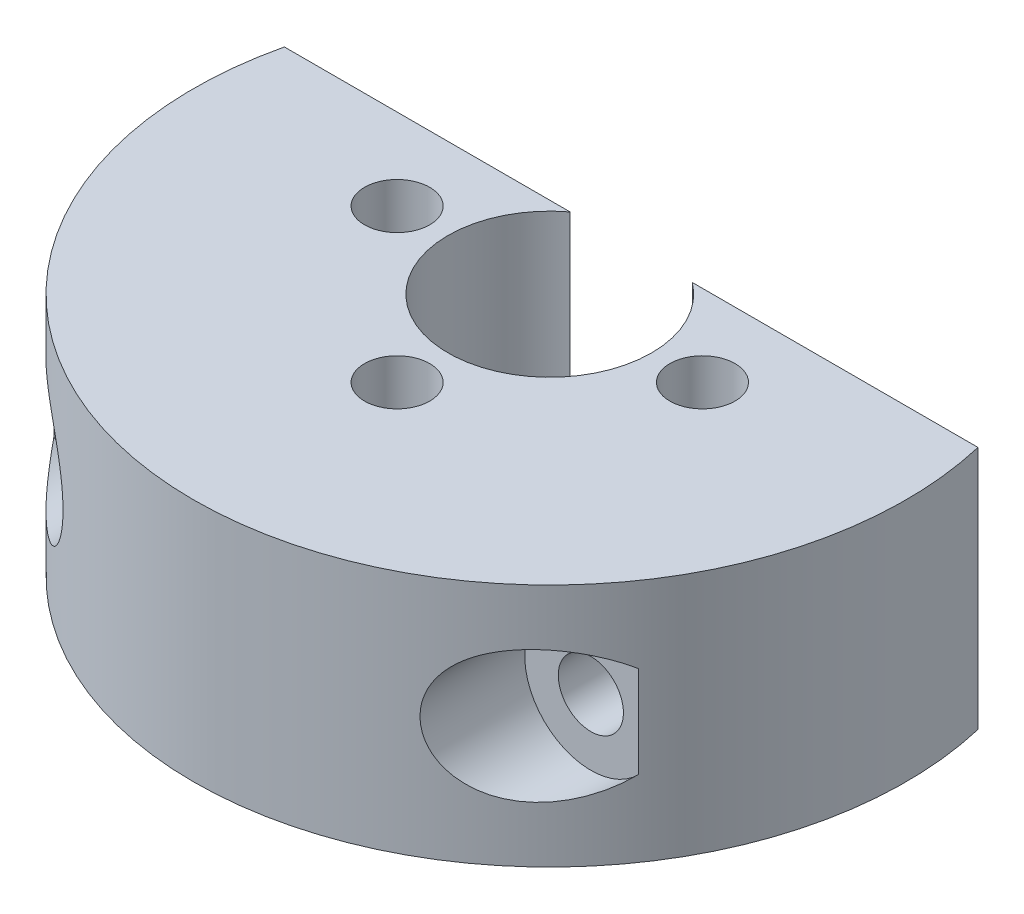
ISO-10303-21;
HEADER;
FILE_DESCRIPTION(('STEP AP214'),'2;1');
FILE_NAME('part.step','',(''),(''),'','','');
FILE_SCHEMA(('AUTOMOTIVE_DESIGN { 1 0 10303 214 1 1 1 1 }'));
ENDSEC;
DATA;
#1=APPLICATION_CONTEXT('core data for automotive mechanical design processes');
#2=APPLICATION_PROTOCOL_DEFINITION('international standard','automotive_design',2000,#1);
#3=PRODUCT_CONTEXT('',#1,'mechanical');
#4=PRODUCT('Part','Part','',(#3));
#5=PRODUCT_RELATED_PRODUCT_CATEGORY('part','',(#4));
#6=PRODUCT_DEFINITION_FORMATION('','',#4);
#7=PRODUCT_DEFINITION_CONTEXT('part definition',#1,'design');
#8=PRODUCT_DEFINITION('design','',#6,#7);
#9=PRODUCT_DEFINITION_SHAPE('','',#8);
#10=(LENGTH_UNIT() NAMED_UNIT(*) SI_UNIT(.MILLI.,.METRE.));
#11=(NAMED_UNIT(*) PLANE_ANGLE_UNIT() SI_UNIT($,.RADIAN.));
#12=(NAMED_UNIT(*) SI_UNIT($,.STERADIAN.) SOLID_ANGLE_UNIT());
#13=UNCERTAINTY_MEASURE_WITH_UNIT(LENGTH_MEASURE(1.E-05),#10,'distance_accuracy_value','');
#14=(GEOMETRIC_REPRESENTATION_CONTEXT(3) GLOBAL_UNCERTAINTY_ASSIGNED_CONTEXT((#13)) GLOBAL_UNIT_ASSIGNED_CONTEXT((#10,
#11,#12)) REPRESENTATION_CONTEXT('',''));
#15=CARTESIAN_POINT('',(0.,0.,0.));
#16=DIRECTION('',(0.,0.,1.));
#17=DIRECTION('',(1.,0.,0.));
#18=AXIS2_PLACEMENT_3D('',#15,#16,#17);
#19=CARTESIAN_POINT('',(-12.0183625187004,6.,17.501));
#20=DIRECTION('',(0.,0.,-1.));
#21=DIRECTION('',(-1.,0.,0.));
#22=AXIS2_PLACEMENT_3D('',#19,#20,#21);
#23=CYLINDRICAL_SURFACE('',#22,1.6);
#24=CARTESIAN_POINT('',(-12.0183625187004,6.,-4.));
#25=DIRECTION('',(0.,0.,-1.));
#26=DIRECTION('',(-1.,0.,0.));
#27=AXIS2_PLACEMENT_3D('',#24,#25,#26);
#28=CIRCLE('',#27,1.6);
#29=CARTESIAN_POINT('',(-13.6183625187004,6.,-4.));
#30=VERTEX_POINT('',#29);
#31=EDGE_CURVE('E207',#30,#30,#28,.T.);
#32=CARTESIAN_POINT('',(-12.0183625187004,6.,10.));
#33=DIRECTION('',(0.,0.,1.));
#34=DIRECTION('',(1.,0.,0.));
#35=AXIS2_PLACEMENT_3D('',#32,#33,#34);
#36=CIRCLE('',#35,1.6);
#37=CARTESIAN_POINT('',(-13.6183625187004,6.,10.));
#38=VERTEX_POINT('',#37);
#39=EDGE_CURVE('E108',#38,#38,#36,.F.);
#40=CARTESIAN_POINT('',(-13.6183625187004,6.,-4.));
#41=CARTESIAN_POINT('',(-13.6183625187004,6.,-3.85416666666666));
#42=CARTESIAN_POINT('',(-13.6183625187004,6.,-3.70833333333333));
#43=CARTESIAN_POINT('',(-13.6183625187004,6.,-3.41666666666666));
#44=CARTESIAN_POINT('',(-13.6183625187004,6.,-3.27083333333333));
#45=CARTESIAN_POINT('',(-13.6183625187004,6.,-2.97916666666666));
#46=CARTESIAN_POINT('',(-13.6183625187004,6.,-2.83333333333333));
#47=CARTESIAN_POINT('',(-13.6183625187004,6.,-2.54166666666666));
#48=CARTESIAN_POINT('',(-13.6183625187004,6.,-2.39583333333333));
#49=CARTESIAN_POINT('',(-13.6183625187004,6.,-2.10416666666666));
#50=CARTESIAN_POINT('',(-13.6183625187004,6.,-1.95833333333333));
#51=CARTESIAN_POINT('',(-13.6183625187004,6.,-1.66666666666666));
#52=CARTESIAN_POINT('',(-13.6183625187004,6.,-1.52083333333333));
#53=CARTESIAN_POINT('',(-13.6183625187004,6.,-1.22916666666666));
#54=CARTESIAN_POINT('',(-13.6183625187004,6.,-1.08333333333333));
#55=CARTESIAN_POINT('',(-13.6183625187004,6.,-0.791666666666662));
#56=CARTESIAN_POINT('',(-13.6183625187004,6.,-0.645833333333329));
#57=CARTESIAN_POINT('',(-13.6183625187004,6.,-0.354166666666664));
#58=CARTESIAN_POINT('',(-13.6183625187004,6.,-0.20833333333333));
#59=CARTESIAN_POINT('',(-13.6183625187004,6.,0.0833333333333368));
#60=CARTESIAN_POINT('',(-13.6183625187004,6.,0.22916666666667));
#61=CARTESIAN_POINT('',(-13.6183625187004,6.,0.520833333333337));
#62=CARTESIAN_POINT('',(-13.6183625187004,6.,0.666666666666671));
#63=CARTESIAN_POINT('',(-13.6183625187004,6.,0.958333333333338));
#64=CARTESIAN_POINT('',(-13.6183625187004,6.,1.10416666666667));
#65=CARTESIAN_POINT('',(-13.6183625187004,6.,1.39583333333334));
#66=CARTESIAN_POINT('',(-13.6183625187004,6.,1.54166666666667));
#67=CARTESIAN_POINT('',(-13.6183625187004,6.,1.83333333333334));
#68=CARTESIAN_POINT('',(-13.6183625187004,6.,1.97916666666667));
#69=CARTESIAN_POINT('',(-13.6183625187004,6.,2.27083333333334));
#70=CARTESIAN_POINT('',(-13.6183625187004,6.,2.41666666666667));
#71=CARTESIAN_POINT('',(-13.6183625187004,6.,2.70833333333334));
#72=CARTESIAN_POINT('',(-13.6183625187004,6.,2.85416666666667));
#73=CARTESIAN_POINT('',(-13.6183625187004,6.,3.14583333333334));
#74=CARTESIAN_POINT('',(-13.6183625187004,6.,3.29166666666667));
#75=CARTESIAN_POINT('',(-13.6183625187004,6.,3.58333333333334));
#76=CARTESIAN_POINT('',(-13.6183625187004,6.,3.72916666666667));
#77=CARTESIAN_POINT('',(-13.6183625187004,6.,4.02083333333334));
#78=CARTESIAN_POINT('',(-13.6183625187004,6.,4.16666666666667));
#79=CARTESIAN_POINT('',(-13.6183625187004,6.,4.45833333333334));
#80=CARTESIAN_POINT('',(-13.6183625187004,6.,4.60416666666667));
#81=CARTESIAN_POINT('',(-13.6183625187004,6.,4.89583333333334));
#82=CARTESIAN_POINT('',(-13.6183625187004,6.,5.04166666666667));
#83=CARTESIAN_POINT('',(-13.6183625187004,6.,5.33333333333334));
#84=CARTESIAN_POINT('',(-13.6183625187004,6.,5.47916666666667));
#85=CARTESIAN_POINT('',(-13.6183625187004,6.,5.77083333333334));
#86=CARTESIAN_POINT('',(-13.6183625187004,6.,5.91666666666667));
#87=CARTESIAN_POINT('',(-13.6183625187004,6.,6.20833333333334));
#88=CARTESIAN_POINT('',(-13.6183625187004,6.,6.35416666666667));
#89=CARTESIAN_POINT('',(-13.6183625187004,6.,6.64583333333334));
#90=CARTESIAN_POINT('',(-13.6183625187004,6.,6.79166666666667));
#91=CARTESIAN_POINT('',(-13.6183625187004,6.,7.08333333333334));
#92=CARTESIAN_POINT('',(-13.6183625187004,6.,7.22916666666667));
#93=CARTESIAN_POINT('',(-13.6183625187004,6.,7.52083333333334));
#94=CARTESIAN_POINT('',(-13.6183625187004,6.,7.66666666666667));
#95=CARTESIAN_POINT('',(-13.6183625187004,6.,7.95833333333334));
#96=CARTESIAN_POINT('',(-13.6183625187004,6.,8.10416666666667));
#97=CARTESIAN_POINT('',(-13.6183625187004,6.,8.39583333333334));
#98=CARTESIAN_POINT('',(-13.6183625187004,6.,8.54166666666667));
#99=CARTESIAN_POINT('',(-13.6183625187004,6.,8.83333333333334));
#100=CARTESIAN_POINT('',(-13.6183625187004,6.,8.97916666666667));
#101=CARTESIAN_POINT('',(-13.6183625187004,6.,9.27083333333334));
#102=CARTESIAN_POINT('',(-13.6183625187004,6.,9.41666666666667));
#103=CARTESIAN_POINT('',(-13.6183625187004,6.,9.70833333333334));
#104=CARTESIAN_POINT('',(-13.6183625187004,6.,9.85416666666667));
#105=CARTESIAN_POINT('',(-13.6183625187004,6.,10.));
#106=B_SPLINE_CURVE_WITH_KNOTS('',3,(#40,#41,#42,#43,#44,#45,#46,#47,#48,#49,#50,#51,#52,#53,
#54,#55,#56,#57,#58,#59,#60,#61,#62,#63,#64,#65,#66,#67,#68,#69,#70,#71,#72,#73,#74,#75,#76,#77,
#78,#79,#80,#81,#82,#83,#84,#85,#86,#87,#88,#89,#90,#91,#92,#93,#94,#95,#96,#97,#98,#99,#100,
#101,#102,#103,#104,#105),.UNSPECIFIED.,.F.,.F.,(4,2,2,2,2,2,2,2,2,2,2,2,2,2,2,2,2,2,2,2,2,2,2,
2,2,2,2,2,2,2,2,2,4),(0.,0.4375,0.875000000000001,1.3125,1.75,2.1875,2.625,3.0625,3.5,3.9375,
4.375,4.8125,5.25,5.6875,6.125,6.5625,7.,7.4375,7.875,8.3125,8.75,9.1875,9.625,10.0625,10.5,
10.9375,11.375,11.8125,12.25,12.6875,13.125,13.5625,14.),.UNSPECIFIED.);
#107=EDGE_CURVE('BSEAM45',#30,#38,#106,.T.);
#108=ORIENTED_EDGE('',*,*,#31,.T.);
#109=ORIENTED_EDGE('',*,*,#39,.F.);
#110=ORIENTED_EDGE('',*,*,#107,.T.);
#111=ORIENTED_EDGE('',*,*,#107,.F.);
#112=EDGE_LOOP('',(#108,#110,#109,#111));
#113=FACE_BOUND('',#112,.T.);
#114=ADVANCED_FACE('F45',(#113),#23,.F.);
#115=CARTESIAN_POINT('',(12.0183625187004,6.,17.501));
#116=DIRECTION('',(0.,0.,-1.));
#117=DIRECTION('',(-1.,0.,0.));
#118=AXIS2_PLACEMENT_3D('',#115,#116,#117);
#119=CYLINDRICAL_SURFACE('',#118,1.6);
#120=CARTESIAN_POINT('',(12.0183625187004,6.,-4.));
#121=DIRECTION('',(0.,0.,-1.));
#122=DIRECTION('',(-1.,0.,0.));
#123=AXIS2_PLACEMENT_3D('',#120,#121,#122);
#124=CIRCLE('',#123,1.6);
#125=CARTESIAN_POINT('',(10.4183625187004,6.,-4.));
#126=VERTEX_POINT('',#125);
#127=EDGE_CURVE('E208',#126,#126,#124,.T.);
#128=CARTESIAN_POINT('',(12.0183625187004,6.,10.));
#129=DIRECTION('',(0.,0.,1.));
#130=DIRECTION('',(1.,0.,0.));
#131=AXIS2_PLACEMENT_3D('',#128,#129,#130);
#132=CIRCLE('',#131,1.6);
#133=CARTESIAN_POINT('',(10.4183625187004,6.,10.));
#134=VERTEX_POINT('',#133);
#135=EDGE_CURVE('E109',#134,#134,#132,.F.);
#136=CARTESIAN_POINT('',(10.4183625187004,6.,-4.));
#137=CARTESIAN_POINT('',(10.4183625187004,6.,-3.85416666666666));
#138=CARTESIAN_POINT('',(10.4183625187004,6.,-3.70833333333333));
#139=CARTESIAN_POINT('',(10.4183625187004,6.,-3.41666666666666));
#140=CARTESIAN_POINT('',(10.4183625187004,6.,-3.27083333333333));
#141=CARTESIAN_POINT('',(10.4183625187004,6.,-2.97916666666666));
#142=CARTESIAN_POINT('',(10.4183625187004,6.,-2.83333333333333));
#143=CARTESIAN_POINT('',(10.4183625187004,6.,-2.54166666666666));
#144=CARTESIAN_POINT('',(10.4183625187004,6.,-2.39583333333333));
#145=CARTESIAN_POINT('',(10.4183625187004,6.,-2.10416666666666));
#146=CARTESIAN_POINT('',(10.4183625187004,6.,-1.95833333333333));
#147=CARTESIAN_POINT('',(10.4183625187004,6.,-1.66666666666666));
#148=CARTESIAN_POINT('',(10.4183625187004,6.,-1.52083333333333));
#149=CARTESIAN_POINT('',(10.4183625187004,6.,-1.22916666666666));
#150=CARTESIAN_POINT('',(10.4183625187004,6.,-1.08333333333333));
#151=CARTESIAN_POINT('',(10.4183625187004,6.,-0.791666666666662));
#152=CARTESIAN_POINT('',(10.4183625187004,6.,-0.645833333333329));
#153=CARTESIAN_POINT('',(10.4183625187004,6.,-0.354166666666664));
#154=CARTESIAN_POINT('',(10.4183625187004,6.,-0.20833333333333));
#155=CARTESIAN_POINT('',(10.4183625187004,6.,0.0833333333333368));
#156=CARTESIAN_POINT('',(10.4183625187004,6.,0.22916666666667));
#157=CARTESIAN_POINT('',(10.4183625187004,6.,0.520833333333337));
#158=CARTESIAN_POINT('',(10.4183625187004,6.,0.666666666666671));
#159=CARTESIAN_POINT('',(10.4183625187004,6.,0.958333333333338));
#160=CARTESIAN_POINT('',(10.4183625187004,6.,1.10416666666667));
#161=CARTESIAN_POINT('',(10.4183625187004,6.,1.39583333333334));
#162=CARTESIAN_POINT('',(10.4183625187004,6.,1.54166666666667));
#163=CARTESIAN_POINT('',(10.4183625187004,6.,1.83333333333334));
#164=CARTESIAN_POINT('',(10.4183625187004,6.,1.97916666666667));
#165=CARTESIAN_POINT('',(10.4183625187004,6.,2.27083333333334));
#166=CARTESIAN_POINT('',(10.4183625187004,6.,2.41666666666667));
#167=CARTESIAN_POINT('',(10.4183625187004,6.,2.70833333333334));
#168=CARTESIAN_POINT('',(10.4183625187004,6.,2.85416666666667));
#169=CARTESIAN_POINT('',(10.4183625187004,6.,3.14583333333334));
#170=CARTESIAN_POINT('',(10.4183625187004,6.,3.29166666666667));
#171=CARTESIAN_POINT('',(10.4183625187004,6.,3.58333333333334));
#172=CARTESIAN_POINT('',(10.4183625187004,6.,3.72916666666667));
#173=CARTESIAN_POINT('',(10.4183625187004,6.,4.02083333333334));
#174=CARTESIAN_POINT('',(10.4183625187004,6.,4.16666666666667));
#175=CARTESIAN_POINT('',(10.4183625187004,6.,4.45833333333334));
#176=CARTESIAN_POINT('',(10.4183625187004,6.,4.60416666666667));
#177=CARTESIAN_POINT('',(10.4183625187004,6.,4.89583333333334));
#178=CARTESIAN_POINT('',(10.4183625187004,6.,5.04166666666667));
#179=CARTESIAN_POINT('',(10.4183625187004,6.,5.33333333333334));
#180=CARTESIAN_POINT('',(10.4183625187004,6.,5.47916666666667));
#181=CARTESIAN_POINT('',(10.4183625187004,6.,5.77083333333334));
#182=CARTESIAN_POINT('',(10.4183625187004,6.,5.91666666666667));
#183=CARTESIAN_POINT('',(10.4183625187004,6.,6.20833333333334));
#184=CARTESIAN_POINT('',(10.4183625187004,6.,6.35416666666667));
#185=CARTESIAN_POINT('',(10.4183625187004,6.,6.64583333333334));
#186=CARTESIAN_POINT('',(10.4183625187004,6.,6.79166666666667));
#187=CARTESIAN_POINT('',(10.4183625187004,6.,7.08333333333334));
#188=CARTESIAN_POINT('',(10.4183625187004,6.,7.22916666666667));
#189=CARTESIAN_POINT('',(10.4183625187004,6.,7.52083333333334));
#190=CARTESIAN_POINT('',(10.4183625187004,6.,7.66666666666667));
#191=CARTESIAN_POINT('',(10.4183625187004,6.,7.95833333333334));
#192=CARTESIAN_POINT('',(10.4183625187004,6.,8.10416666666667));
#193=CARTESIAN_POINT('',(10.4183625187004,6.,8.39583333333334));
#194=CARTESIAN_POINT('',(10.4183625187004,6.,8.54166666666667));
#195=CARTESIAN_POINT('',(10.4183625187004,6.,8.83333333333334));
#196=CARTESIAN_POINT('',(10.4183625187004,6.,8.97916666666667));
#197=CARTESIAN_POINT('',(10.4183625187004,6.,9.27083333333334));
#198=CARTESIAN_POINT('',(10.4183625187004,6.,9.41666666666667));
#199=CARTESIAN_POINT('',(10.4183625187004,6.,9.70833333333334));
#200=CARTESIAN_POINT('',(10.4183625187004,6.,9.85416666666667));
#201=CARTESIAN_POINT('',(10.4183625187004,6.,10.));
#202=B_SPLINE_CURVE_WITH_KNOTS('',3,(#136,#137,#138,#139,#140,#141,#142,#143,#144,#145,#146,
#147,#148,#149,#150,#151,#152,#153,#154,#155,#156,#157,#158,#159,#160,#161,#162,#163,#164,#165,
#166,#167,#168,#169,#170,#171,#172,#173,#174,#175,#176,#177,#178,#179,#180,#181,#182,#183,#184,
#185,#186,#187,#188,#189,#190,#191,#192,#193,#194,#195,#196,#197,#198,#199,#200,#201),
.UNSPECIFIED.,.F.,.F.,(4,2,2,2,2,2,2,2,2,2,2,2,2,2,2,2,2,2,2,2,2,2,2,2,2,2,2,2,2,2,2,2,4),(0.,
0.4375,0.875000000000001,1.3125,1.75,2.1875,2.625,3.0625,3.5,3.9375,4.375,4.8125,5.25,5.6875,
6.125,6.5625,7.,7.4375,7.875,8.3125,8.75,9.1875,9.625,10.0625,10.5,10.9375,11.375,11.8125,12.25,
12.6875,13.125,13.5625,14.),.UNSPECIFIED.);
#203=EDGE_CURVE('BSEAM140',#126,#134,#202,.T.);
#204=ORIENTED_EDGE('',*,*,#127,.T.);
#205=ORIENTED_EDGE('',*,*,#135,.F.);
#206=ORIENTED_EDGE('',*,*,#203,.T.);
#207=ORIENTED_EDGE('',*,*,#203,.F.);
#208=EDGE_LOOP('',(#204,#206,#205,#207));
#209=FACE_BOUND('',#208,.T.);
#210=ADVANCED_FACE('F140',(#209),#119,.F.);
#211=CARTESIAN_POINT('',(0.,12.,0.));
#212=DIRECTION('',(0.,1.,0.));
#213=DIRECTION('',(0.,0.,1.));
#214=AXIS2_PLACEMENT_3D('',#211,#212,#213);
#215=PLANE('',#214);
#216=CARTESIAN_POINT('',(-7.5,12.,0.));
#217=DIRECTION('',(0.,1.,0.));
#218=DIRECTION('',(0.,0.,1.));
#219=AXIS2_PLACEMENT_3D('',#216,#217,#218);
#220=CIRCLE('',#219,1.6);
#221=CARTESIAN_POINT('',(-7.5,12.,1.6));
#222=VERTEX_POINT('',#221);
#223=EDGE_CURVE('E354',#222,#222,#220,.T.);
#224=ORIENTED_EDGE('',*,*,#223,.F.);
#225=EDGE_LOOP('',(#224));
#226=FACE_BOUND('',#225,.T.);
#227=CARTESIAN_POINT('',(7.5,12.,0.));
#228=DIRECTION('',(0.,1.,0.));
#229=DIRECTION('',(0.,0.,1.));
#230=AXIS2_PLACEMENT_3D('',#227,#228,#229);
#231=CIRCLE('',#230,1.6);
#232=CARTESIAN_POINT('',(7.5,12.,1.6));
#233=VERTEX_POINT('',#232);
#234=EDGE_CURVE('E356',#233,#233,#231,.T.);
#235=ORIENTED_EDGE('',*,*,#234,.F.);
#236=EDGE_LOOP('',(#235));
#237=FACE_BOUND('',#236,.T.);
#238=CARTESIAN_POINT('',(0.,12.,7.5));
#239=DIRECTION('',(0.,1.,0.));
#240=DIRECTION('',(0.,0.,1.));
#241=AXIS2_PLACEMENT_3D('',#238,#239,#240);
#242=CIRCLE('',#241,1.6);
#243=CARTESIAN_POINT('',(0.,12.,9.1));
#244=VERTEX_POINT('',#243);
#245=EDGE_CURVE('E365',#244,#244,#242,.T.);
#246=ORIENTED_EDGE('',*,*,#245,.F.);
#247=EDGE_LOOP('',(#246));
#248=FACE_BOUND('',#247,.T.);
#249=DIRECTION('',(-1.,0.,0.));
#250=VECTOR('',#249,1.);
#251=CARTESIAN_POINT('',(0.,12.,-4.));
#252=LINE('',#251,#250);
#253=CARTESIAN_POINT('',(-3.,12.,-4.));
#254=VERTEX_POINT('',#253);
#255=CARTESIAN_POINT('',(-17.0367250374008,12.,-4.));
#256=VERTEX_POINT('',#255);
#257=EDGE_CURVE('E226',#254,#256,#252,.T.);
#258=ORIENTED_EDGE('',*,*,#257,.T.);
#259=CARTESIAN_POINT('',(0.,12.,0.));
#260=DIRECTION('',(0.,1.,0.));
#261=DIRECTION('',(0.,0.,1.));
#262=AXIS2_PLACEMENT_3D('',#259,#260,#261);
#263=CIRCLE('',#262,17.5);
#264=CARTESIAN_POINT('',(17.0367250374008,12.,-4.));
#265=VERTEX_POINT('',#264);
#266=EDGE_CURVE('E118',#256,#265,#263,.T.);
#267=ORIENTED_EDGE('',*,*,#266,.T.);
#268=CARTESIAN_POINT('',(3.,12.,-4.));
#269=VERTEX_POINT('',#268);
#270=EDGE_CURVE('E221',#265,#269,#252,.T.);
#271=ORIENTED_EDGE('',*,*,#270,.T.);
#272=CARTESIAN_POINT('',(0.,12.,0.));
#273=DIRECTION('',(0.,1.,0.));
#274=DIRECTION('',(0.,0.,1.));
#275=AXIS2_PLACEMENT_3D('',#272,#273,#274);
#276=CIRCLE('',#275,5.);
#277=EDGE_CURVE('E188',#254,#269,#276,.T.);
#278=ORIENTED_EDGE('',*,*,#277,.F.);
#279=EDGE_LOOP('',(#258,#267,#271,#278));
#280=FACE_BOUND('',#279,.T.);
#281=ADVANCED_FACE('F143',(#226,#237,#248,#280),#215,.T.);
#282=CARTESIAN_POINT('',(0.,0.,0.));
#283=DIRECTION('',(0.,1.,0.));
#284=DIRECTION('',(0.,0.,1.));
#285=AXIS2_PLACEMENT_3D('',#282,#283,#284);
#286=PLANE('',#285);
#287=CARTESIAN_POINT('',(-7.5,0.,0.));
#288=DIRECTION('',(0.,1.,0.));
#289=DIRECTION('',(0.,0.,1.));
#290=AXIS2_PLACEMENT_3D('',#287,#288,#289);
#291=CIRCLE('',#290,1.6);
#292=CARTESIAN_POINT('',(-7.5,0.,1.6));
#293=VERTEX_POINT('',#292);
#294=EDGE_CURVE('E114',#293,#293,#291,.T.);
#295=ORIENTED_EDGE('',*,*,#294,.T.);
#296=EDGE_LOOP('',(#295));
#297=FACE_BOUND('',#296,.T.);
#298=CARTESIAN_POINT('',(7.5,0.,0.));
#299=DIRECTION('',(0.,1.,0.));
#300=DIRECTION('',(0.,0.,1.));
#301=AXIS2_PLACEMENT_3D('',#298,#299,#300);
#302=CIRCLE('',#301,1.6);
#303=CARTESIAN_POINT('',(7.5,0.,1.6));
#304=VERTEX_POINT('',#303);
#305=EDGE_CURVE('E172',#304,#304,#302,.T.);
#306=ORIENTED_EDGE('',*,*,#305,.T.);
#307=EDGE_LOOP('',(#306));
#308=FACE_BOUND('',#307,.T.);
#309=CARTESIAN_POINT('',(0.,0.,7.5));
#310=DIRECTION('',(0.,1.,0.));
#311=DIRECTION('',(0.,0.,1.));
#312=AXIS2_PLACEMENT_3D('',#309,#310,#311);
#313=CIRCLE('',#312,1.6);
#314=CARTESIAN_POINT('',(0.,0.,9.1));
#315=VERTEX_POINT('',#314);
#316=EDGE_CURVE('E176',#315,#315,#313,.T.);
#317=ORIENTED_EDGE('',*,*,#316,.T.);
#318=EDGE_LOOP('',(#317));
#319=FACE_BOUND('',#318,.T.);
#320=CARTESIAN_POINT('',(0.,0.,0.));
#321=DIRECTION('',(0.,1.,0.));
#322=DIRECTION('',(0.,0.,1.));
#323=AXIS2_PLACEMENT_3D('',#320,#321,#322);
#324=CIRCLE('',#323,17.5);
#325=CARTESIAN_POINT('',(-17.0367250374008,0.,-4.));
#326=VERTEX_POINT('',#325);
#327=CARTESIAN_POINT('',(17.0367250374008,0.,-4.));
#328=VERTEX_POINT('',#327);
#329=EDGE_CURVE('E121',#326,#328,#324,.T.);
#330=ORIENTED_EDGE('',*,*,#329,.F.);
#331=DIRECTION('',(1.,0.,0.));
#332=VECTOR('',#331,1.);
#333=CARTESIAN_POINT('',(-20.0274378057757,0.,-4.));
#334=LINE('',#333,#332);
#335=CARTESIAN_POINT('',(-3.,0.,-4.));
#336=VERTEX_POINT('',#335);
#337=EDGE_CURVE('E182',#326,#336,#334,.T.);
#338=ORIENTED_EDGE('',*,*,#337,.T.);
#339=CARTESIAN_POINT('',(0.,0.,0.));
#340=DIRECTION('',(0.,1.,0.));
#341=DIRECTION('',(0.,0.,1.));
#342=AXIS2_PLACEMENT_3D('',#339,#340,#341);
#343=CIRCLE('',#342,5.);
#344=CARTESIAN_POINT('',(3.,0.,-4.));
#345=VERTEX_POINT('',#344);
#346=EDGE_CURVE('E192',#336,#345,#343,.T.);
#347=ORIENTED_EDGE('',*,*,#346,.T.);
#348=EDGE_CURVE('E184',#345,#328,#334,.T.);
#349=ORIENTED_EDGE('',*,*,#348,.T.);
#350=EDGE_LOOP('',(#330,#338,#347,#349));
#351=FACE_BOUND('',#350,.T.);
#352=ADVANCED_FACE('F157',(#297,#308,#319,#351),#286,.F.);
#353=CARTESIAN_POINT('',(0.,12.,0.));
#354=DIRECTION('',(0.,-1.,0.));
#355=DIRECTION('',(0.,0.,-1.));
#356=AXIS2_PLACEMENT_3D('',#353,#354,#355);
#357=CYLINDRICAL_SURFACE('',#356,17.5);
#358=DIRECTION('',(0.,-1.,0.));
#359=VECTOR('',#358,1.);
#360=CARTESIAN_POINT('',(-14.3614066163451,12.,10.));
#361=LINE('',#360,#359);
#362=CARTESIAN_POINT('',(-14.3614066163451,8.25225317326728,10.));
#363=VERTEX_POINT('',#362);
#364=CARTESIAN_POINT('',(-14.3614066163451,3.74774682673272,10.));
#365=VERTEX_POINT('',#364);
#366=EDGE_CURVE('E204',#363,#365,#361,.T.);
#367=ORIENTED_EDGE('',*,*,#366,.F.);
#368=CARTESIAN_POINT('',(-14.3614066163451,8.25225317326728,10.));
#369=CARTESIAN_POINT('',(-14.3152089878973,8.30030035832179,10.0663501126585));
#370=CARTESIAN_POINT('',(-14.2679379858563,8.34653054202306,10.1332537839939));
#371=CARTESIAN_POINT('',(-14.1713475714007,8.43546285697048,10.2678990512005));
#372=CARTESIAN_POINT('',(-14.1220285482279,8.47816565405283,10.3356404861453));
#373=CARTESIAN_POINT('',(-14.0214330998337,8.5601589099856,10.4717035649905));
#374=CARTESIAN_POINT('',(-13.9701570743258,8.59945006034482,10.5400250882159));
#375=CARTESIAN_POINT('',(-13.865707359065,8.67468871772514,10.6770588595602));
#376=CARTESIAN_POINT('',(-13.8125335142437,8.71063595064983,10.7457711392198));
#377=CARTESIAN_POINT('',(-13.6491322530579,8.81422291562551,10.9536495977377));
#378=CARTESIAN_POINT('',(-13.5360558245076,8.87677041654454,11.0931585513794));
#379=CARTESIAN_POINT('',(-13.3028642000647,8.98818510357152,11.3717556910531));
#380=CARTESIAN_POINT('',(-13.1827481993311,9.03705072171261,11.5108438270534));
#381=CARTESIAN_POINT('',(-12.9347334232153,9.12090783806923,11.7888805663958));
#382=CARTESIAN_POINT('',(-12.8067694009941,9.15575727571905,11.9278141724243));
#383=CARTESIAN_POINT('',(-12.5448264328187,9.20986247369731,12.2030082064431));
#384=CARTESIAN_POINT('',(-12.410848593243,9.22912109000253,12.3392691195616));
#385=CARTESIAN_POINT('',(-12.138277550712,9.25065093024795,12.6074822984103));
#386=CARTESIAN_POINT('',(-11.9997040794447,9.25298720055931,12.7394491192257));
#387=CARTESIAN_POINT('',(-11.7188638290354,9.23922167245344,12.9982573899918));
#388=CARTESIAN_POINT('',(-11.5765994300279,9.22313148123099,13.1251020144337));
#389=CARTESIAN_POINT('',(-11.2528567408943,9.16388059720964,13.404471483182));
#390=CARTESIAN_POINT('',(-11.070776916511,9.11478168401795,13.5551251490955));
#391=CARTESIAN_POINT('',(-10.7090292583417,8.98081651576822,13.8426857726485));
#392=CARTESIAN_POINT('',(-10.5293585148237,8.89599836309227,13.9796109123204));
#393=CARTESIAN_POINT('',(-10.2093927141151,8.7053023206346,14.2144578567145));
#394=CARTESIAN_POINT('',(-10.0675661906045,8.60538604868865,14.315063408337));
#395=CARTESIAN_POINT('',(-9.86437731621015,8.43529905569341,14.4551339448326));
#396=CARTESIAN_POINT('',(-9.79820770066914,8.37519823507509,14.5000382806366));
#397=CARTESIAN_POINT('',(-9.66984757709694,8.24835631065557,14.5859518816317));
#398=CARTESIAN_POINT('',(-9.60765531132182,8.18161817392826,14.626962871379));
#399=CARTESIAN_POINT('',(-9.4875921533228,8.0411534232812,14.7051274854508));
#400=CARTESIAN_POINT('',(-9.42975966343179,7.96737533878145,14.7422477526219));
#401=CARTESIAN_POINT('',(-9.31985986376183,7.81369796501525,14.8119696721118));
#402=CARTESIAN_POINT('',(-9.26778960799808,7.73380183932573,14.8445736355907));
#403=CARTESIAN_POINT('',(-9.17023997852079,7.56841094137558,14.9050324956701));
#404=CARTESIAN_POINT('',(-9.12475872326761,7.48291777755688,14.9328887484185));
#405=CARTESIAN_POINT('',(-9.0411627056749,7.30700426296507,14.9836501329275));
#406=CARTESIAN_POINT('',(-9.00304674648315,7.21658471579012,15.0065560691807));
#407=CARTESIAN_POINT('',(-8.9393671953573,7.0438444411248,15.0445638653009));
#408=CARTESIAN_POINT('',(-8.91281140631758,6.96202646517199,15.0602963391084));
#409=CARTESIAN_POINT('',(-8.86614029179997,6.79589072138369,15.0878192988272));
#410=CARTESIAN_POINT('',(-8.84602717413696,6.71157210740579,15.0996084334714));
#411=CARTESIAN_POINT('',(-8.81256871926227,6.54121224577185,15.1191604207826));
#412=CARTESIAN_POINT('',(-8.79921762837596,6.45517252759615,15.1269266965488));
#413=CARTESIAN_POINT('',(-8.77944729463554,6.28202457619353,15.1384089123572));
#414=CARTESIAN_POINT('',(-8.77303047712146,6.19491597988098,15.1421234352576));
#415=CARTESIAN_POINT('',(-8.7648420875355,5.94719978579935,15.1468697712831));
#416=CARTESIAN_POINT('',(-8.77145688606775,5.78611262904426,15.1430522126426));
#417=CARTESIAN_POINT('',(-8.80823976277277,5.46770751751733,15.1216841292467));
#418=CARTESIAN_POINT('',(-8.83840345623652,5.31038886668472,15.1041361610368));
#419=CARTESIAN_POINT('',(-8.92031719551109,5.0053713140753,15.0559009992675));
#420=CARTESIAN_POINT('',(-8.97184311268006,4.85759042474491,15.0253501436916));
#421=CARTESIAN_POINT('',(-9.09403421079317,4.57356205504861,14.9517090280065));
#422=CARTESIAN_POINT('',(-9.1647016541643,4.43731594053212,14.9086172855861));
#423=CARTESIAN_POINT('',(-9.32588422273243,4.17293586989819,14.8083517789508));
#424=CARTESIAN_POINT('',(-9.4171882810058,4.04550368832439,14.7506020749953));
#425=CARTESIAN_POINT('',(-9.61355713655337,3.80839355510047,14.6233783988346));
#426=CARTESIAN_POINT('',(-9.71862648425048,3.69872150138184,14.5539005474285));
#427=CARTESIAN_POINT('',(-9.95044583131896,3.4873545783857,14.3965362096935));
#428=CARTESIAN_POINT('',(-10.0783127501737,3.38776777512649,14.3074755784535));
#429=CARTESIAN_POINT('',(-10.3415079456815,3.21149125541486,14.1184091527406));
#430=CARTESIAN_POINT('',(-10.4768404281105,3.13481460487422,14.0183971568407));
#431=CARTESIAN_POINT('',(-10.7128879460913,3.02169497967383,13.838337475153));
#432=CARTESIAN_POINT('',(-10.8127901150747,2.97999161310745,13.7604492767943));
#433=CARTESIAN_POINT('',(-11.0132554915374,2.90748873805667,13.6005399817547));
#434=CARTESIAN_POINT('',(-11.1138189091821,2.87669288574034,13.5185175097807));
#435=CARTESIAN_POINT('',(-11.4152963063787,2.79970913502578,13.2668479512384));
#436=CARTESIAN_POINT('',(-11.6157984429841,2.7690162066887,13.0917496397528));
#437=CARTESIAN_POINT('',(-11.9407354646504,2.74838402854848,12.7945025122673));
#438=CARTESIAN_POINT('',(-12.0673324960921,2.74797110747625,12.6751623837761));
#439=CARTESIAN_POINT('',(-12.3165908342463,2.76130833636838,12.4330889088657));
#440=CARTESIAN_POINT('',(-12.4392509635764,2.77506268328487,12.31035456742));
#441=CARTESIAN_POINT('',(-12.6799287110947,2.81570241702571,12.0623107072141));
#442=CARTESIAN_POINT('',(-12.7979408954313,2.84260270739742,11.936998420663));
#443=CARTESIAN_POINT('',(-13.0286635678112,2.90869089504283,11.6847394895428));
#444=CARTESIAN_POINT('',(-13.1413736859402,2.94787964819934,11.5577927317246));
#445=CARTESIAN_POINT('',(-13.3549915950721,3.03545908530159,11.3101479838943));
#446=CARTESIAN_POINT('',(-13.4562073981062,3.08322149105861,11.1894924034692));
#447=CARTESIAN_POINT('',(-13.6532150654852,3.18890538299973,10.9482404005543));
#448=CARTESIAN_POINT('',(-13.7490077765151,3.24682527751837,10.8276439717603));
#449=CARTESIAN_POINT('',(-13.934418797172,3.37250857442172,10.5879553401002));
#450=CARTESIAN_POINT('',(-14.0240662327621,3.44022001112152,10.4688585957093));
#451=CARTESIAN_POINT('',(-14.1540230796108,3.54955960675549,10.2916959468547));
#452=CARTESIAN_POINT('',(-14.1965987705329,3.58731097164469,10.2328756613928));
#453=CARTESIAN_POINT('',(-14.2801889818432,3.66549584849719,10.1158972576189));
#454=CARTESIAN_POINT('',(-14.3212032809793,3.70592973836917,10.057739233963));
#455=CARTESIAN_POINT('',(-14.3614066163451,3.74774682673271,10.));
#456=B_SPLINE_CURVE_WITH_KNOTS('',3,(#368,#369,#370,#371,#372,#373,#374,#375,#376,#377,#378,
#379,#380,#381,#382,#383,#384,#385,#386,#387,#388,#389,#390,#391,#392,#393,#394,#395,#396,#397,
#398,#399,#400,#401,#402,#403,#404,#405,#406,#407,#408,#409,#410,#411,#412,#413,#414,#415,#416,
#417,#418,#419,#420,#421,#422,#423,#424,#425,#426,#427,#428,#429,#430,#431,#432,#433,#434,#435,
#436,#437,#438,#439,#440,#441,#442,#443,#444,#445,#446,#447,#448,#449,#450,#451,#452,#453,#454,
#455),.UNSPECIFIED.,.F.,.F.,(4,2,2,2,2,2,2,2,2,2,2,2,2,2,2,2,2,2,2,2,2,2,2,2,2,2,2,2,2,2,2,2,2,
2,2,2,2,2,2,2,2,2,2,4),(0.,0.282104003729665,0.564154634702892,0.846147962551577,
1.12816438468279,1.69796672437023,2.26783433766525,2.84334047099763,3.41874115739598,
3.99192893038584,4.56475583950238,5.28613779159197,6.00655136408014,6.60550453207601,
6.90529197632853,7.20494600413225,7.50698886545996,7.80887658467638,8.11067792689584,
8.41243018542296,8.67442154043859,8.93650258047712,9.19836024472611,9.46030946702137,
9.94155915836225,10.4227192643216,10.8989539918608,11.3752450324023,11.8743638623002,
12.3736481053358,12.9263378499221,13.4793422005226,13.8789184263402,14.2786284625095,
15.0788362309822,15.6002236849334,16.1217656406356,16.643900244608,17.1660712229698,
17.6593827862337,18.1526171171668,18.6433237920511,18.8887882856782,19.1342874335797),.UNSPECIFIED.);
#457=EDGE_CURVE('E11',#363,#365,#456,.T.);
#458=ORIENTED_EDGE('',*,*,#457,.T.);
#459=EDGE_LOOP('',(#367,#458));
#460=FACE_BOUND('',#459,.T.);
#461=DIRECTION('',(0.,-1.,0.));
#462=VECTOR('',#461,1.);
#463=CARTESIAN_POINT('',(14.3614066163451,12.,10.));
#464=LINE('',#463,#462);
#465=CARTESIAN_POINT('',(14.3614066163451,3.74774682673272,10.));
#466=VERTEX_POINT('',#465);
#467=CARTESIAN_POINT('',(14.3614066163451,8.25225317326728,10.));
#468=VERTEX_POINT('',#467);
#469=EDGE_CURVE('E103',#466,#468,#464,.F.);
#470=ORIENTED_EDGE('',*,*,#469,.F.);
#471=CARTESIAN_POINT('',(14.3614066163451,3.74774682673272,10.));
#472=CARTESIAN_POINT('',(14.3152089878973,3.69969964167821,10.0663501126585));
#473=CARTESIAN_POINT('',(14.2679379858563,3.65346945797694,10.1332537839939));
#474=CARTESIAN_POINT('',(14.1713475714007,3.56453714302952,10.2678990512005));
#475=CARTESIAN_POINT('',(14.1220285482279,3.52183434594717,10.3356404861453));
#476=CARTESIAN_POINT('',(14.0214330998337,3.4398410900144,10.4717035649905));
#477=CARTESIAN_POINT('',(13.9701570743259,3.40054993965518,10.5400250882159));
#478=CARTESIAN_POINT('',(13.865707359065,3.32531128227486,10.6770588595602));
#479=CARTESIAN_POINT('',(13.8125335142438,3.28936404935017,10.7457711392198));
#480=CARTESIAN_POINT('',(13.6491322530579,3.18577708437449,10.9536495977377));
#481=CARTESIAN_POINT('',(13.5360558245076,3.12322958345546,11.0931585513794));
#482=CARTESIAN_POINT('',(13.3028642000647,3.01181489642848,11.3717556910531));
#483=CARTESIAN_POINT('',(13.1827481993312,2.96294927828739,11.5108438270534));
#484=CARTESIAN_POINT('',(12.9347334232153,2.87909216193077,11.7888805663958));
#485=CARTESIAN_POINT('',(12.8067694009941,2.84424272428095,11.9278141724243));
#486=CARTESIAN_POINT('',(12.5448264328187,2.79013752630269,12.2030082064431));
#487=CARTESIAN_POINT('',(12.410848593243,2.77087890999747,12.3392691195616));
#488=CARTESIAN_POINT('',(12.138277550712,2.74934906975204,12.6074822984103));
#489=CARTESIAN_POINT('',(11.9997040794447,2.74701279944069,12.7394491192257));
#490=CARTESIAN_POINT('',(11.7188638290355,2.76077832754655,12.9982573899917));
#491=CARTESIAN_POINT('',(11.5765994300279,2.776868518769,13.1251020144337));
#492=CARTESIAN_POINT('',(11.2528567408943,2.83611940279036,13.4044714831819));
#493=CARTESIAN_POINT('',(11.070776916511,2.88521831598204,13.5551251490954));
#494=CARTESIAN_POINT('',(10.7090292583417,3.01918348423177,13.8426857726485));
#495=CARTESIAN_POINT('',(10.5293585148237,3.10400163690772,13.9796109123204));
#496=CARTESIAN_POINT('',(10.2093927141151,3.29469767936539,14.2144578567145));
#497=CARTESIAN_POINT('',(10.0675661906045,3.39461395131134,14.315063408337));
#498=CARTESIAN_POINT('',(9.86437731621015,3.56470094430658,14.4551339448326));
#499=CARTESIAN_POINT('',(9.79820770066915,3.6248017649249,14.5000382806366));
#500=CARTESIAN_POINT('',(9.66984757709694,3.75164368934442,14.5859518816317));
#501=CARTESIAN_POINT('',(9.60765531132183,3.81838182607173,14.6269628713789));
#502=CARTESIAN_POINT('',(9.4875921533228,3.95884657671879,14.7051274854508));
#503=CARTESIAN_POINT('',(9.42975966343179,4.03262466121854,14.7422477526219));
#504=CARTESIAN_POINT('',(9.31985986376184,4.18630203498475,14.8119696721118));
#505=CARTESIAN_POINT('',(9.26778960799808,4.26619816067426,14.8445736355907));
#506=CARTESIAN_POINT('',(9.17023997852079,4.43158905862442,14.9050324956701));
#507=CARTESIAN_POINT('',(9.12475872326761,4.51708222244312,14.9328887484185));
#508=CARTESIAN_POINT('',(9.0411627056749,4.69299573703493,14.9836501329275));
#509=CARTESIAN_POINT('',(9.00304674648315,4.78341528420988,15.0065560691807));
#510=CARTESIAN_POINT('',(8.9393671953573,4.9561555588752,15.0445638653009));
#511=CARTESIAN_POINT('',(8.91281140631758,5.03797353482801,15.0602963391084));
#512=CARTESIAN_POINT('',(8.86614029179997,5.20410927861631,15.0878192988272));
#513=CARTESIAN_POINT('',(8.84602717413696,5.28842789259421,15.0996084334714));
#514=CARTESIAN_POINT('',(8.81256871926227,5.45878775422815,15.1191604207826));
#515=CARTESIAN_POINT('',(8.79921762837596,5.54482747240384,15.1269266965488));
#516=CARTESIAN_POINT('',(8.77944729463554,5.71797542380647,15.1384089123573));
#517=CARTESIAN_POINT('',(8.77303047712145,5.80508402011902,15.1421234352576));
#518=CARTESIAN_POINT('',(8.7648420875355,6.05280021420065,15.1468697712831));
#519=CARTESIAN_POINT('',(8.77145688606775,6.21388737095574,15.1430522126426));
#520=CARTESIAN_POINT('',(8.80823976277277,6.53229248248266,15.1216841292467));
#521=CARTESIAN_POINT('',(8.83840345623652,6.68961113331527,15.1041361610368));
#522=CARTESIAN_POINT('',(8.92031719551109,6.99462868592469,15.0559009992675));
#523=CARTESIAN_POINT('',(8.97184311268006,7.14240957525508,15.0253501436916));
#524=CARTESIAN_POINT('',(9.09403421079317,7.42643794495139,14.9517090280065));
#525=CARTESIAN_POINT('',(9.1647016541643,7.56268405946788,14.9086172855861));
#526=CARTESIAN_POINT('',(9.32588422273243,7.82706413010181,14.8083517789508));
#527=CARTESIAN_POINT('',(9.4171882810058,7.95449631167561,14.7506020749953));
#528=CARTESIAN_POINT('',(9.61355713655337,8.19160644489953,14.6233783988346));
#529=CARTESIAN_POINT('',(9.71862648425048,8.30127849861815,14.5539005474285));
#530=CARTESIAN_POINT('',(9.95044583131895,8.5126454216143,14.3965362096935));
#531=CARTESIAN_POINT('',(10.0783127501737,8.61223222487351,14.3074755784535));
#532=CARTESIAN_POINT('',(10.3415079456815,8.78850874458514,14.1184091527406));
#533=CARTESIAN_POINT('',(10.4768404281105,8.86518539512578,14.0183971568407));
#534=CARTESIAN_POINT('',(10.7128879460913,8.97830502032616,13.838337475153));
#535=CARTESIAN_POINT('',(10.8127901150747,9.02000838689255,13.7604492767943));
#536=CARTESIAN_POINT('',(11.0132554915374,9.09251126194332,13.6005399817547));
#537=CARTESIAN_POINT('',(11.1138189091821,9.12330711425965,13.5185175097807));
#538=CARTESIAN_POINT('',(11.4152963063786,9.20029086497422,13.2668479512384));
#539=CARTESIAN_POINT('',(11.6157984429841,9.2309837933113,13.0917496397528));
#540=CARTESIAN_POINT('',(11.9407354646504,9.25161597145152,12.7945025122673));
#541=CARTESIAN_POINT('',(12.0673324960921,9.25202889252375,12.6751623837761));
#542=CARTESIAN_POINT('',(12.3165908342463,9.23869166363162,12.4330889088657));
#543=CARTESIAN_POINT('',(12.4392509635764,9.22493731671513,12.31035456742));
#544=CARTESIAN_POINT('',(12.6799287110947,9.18429758297429,12.0623107072141));
#545=CARTESIAN_POINT('',(12.7979408954313,9.15739729260258,11.9369984206631));
#546=CARTESIAN_POINT('',(13.0286635678112,9.09130910495717,11.6847394895428));
#547=CARTESIAN_POINT('',(13.1413736859402,9.05212035180066,11.5577927317246));
#548=CARTESIAN_POINT('',(13.3549915950721,8.96454091469841,11.3101479838943));
#549=CARTESIAN_POINT('',(13.4562073981062,8.9167785089414,11.1894924034692));
#550=CARTESIAN_POINT('',(13.6532150654852,8.81109461700028,10.9482404005543));
#551=CARTESIAN_POINT('',(13.7490077765151,8.75317472248163,10.8276439717603));
#552=CARTESIAN_POINT('',(13.934418797172,8.62749142557828,10.5879553401002));
#553=CARTESIAN_POINT('',(14.024066232762,8.55977998887848,10.4688585957093));
#554=CARTESIAN_POINT('',(14.1540230796107,8.45044039324451,10.2916959468547));
#555=CARTESIAN_POINT('',(14.1965987705329,8.41268902835531,10.2328756613928));
#556=CARTESIAN_POINT('',(14.2801889818432,8.33450415150281,10.1158972576189));
#557=CARTESIAN_POINT('',(14.3212032809793,8.29407026163082,10.057739233963));
#558=CARTESIAN_POINT('',(14.3614066163451,8.25225317326728,10.));
#559=B_SPLINE_CURVE_WITH_KNOTS('',3,(#471,#472,#473,#474,#475,#476,#477,#478,#479,#480,#481,
#482,#483,#484,#485,#486,#487,#488,#489,#490,#491,#492,#493,#494,#495,#496,#497,#498,#499,#500,
#501,#502,#503,#504,#505,#506,#507,#508,#509,#510,#511,#512,#513,#514,#515,#516,#517,#518,#519,
#520,#521,#522,#523,#524,#525,#526,#527,#528,#529,#530,#531,#532,#533,#534,#535,#536,#537,#538,
#539,#540,#541,#542,#543,#544,#545,#546,#547,#548,#549,#550,#551,#552,#553,#554,#555,#556,#557,
#558),.UNSPECIFIED.,.F.,.F.,(4,2,2,2,2,2,2,2,2,2,2,2,2,2,2,2,2,2,2,2,2,2,2,2,2,2,2,2,2,2,2,2,2,
2,2,2,2,2,2,2,2,2,2,4),(0.,0.282104003729666,0.564154634702889,0.846147962551574,
1.12816438468278,1.69796672437022,2.26783433766524,2.84334047099762,3.41874115739597,
3.99192893038583,4.56475583950236,5.28613779159196,6.00655136408013,6.60550453207601,
6.90529197632852,7.20494600413225,7.50698886545996,7.80887658467638,8.11067792689584,
8.41243018542297,8.67442154043859,8.93650258047712,9.19836024472611,9.46030946702137,
9.94155915836225,10.4227192643216,10.8989539918608,11.3752450324023,11.8743638623002,
12.3736481053358,12.9263378499221,13.4793422005226,13.8789184263402,14.2786284625095,
15.0788362309822,15.6002236849334,16.1217656406356,16.643900244608,17.1660712229698,
17.6593827862337,18.1526171171668,18.6433237920511,18.8887882856782,19.1342874335797),.UNSPECIFIED.);
#560=EDGE_CURVE('E60',#466,#468,#559,.T.);
#561=ORIENTED_EDGE('',*,*,#560,.T.);
#562=EDGE_LOOP('',(#470,#561));
#563=FACE_BOUND('',#562,.T.);
#564=ORIENTED_EDGE('',*,*,#266,.F.);
#565=DIRECTION('',(0.,-1.,0.));
#566=VECTOR('',#565,1.);
#567=CARTESIAN_POINT('',(-17.0367250374008,12.,-4.));
#568=LINE('',#567,#566);
#569=EDGE_CURVE('E233',#326,#256,#568,.F.);
#570=ORIENTED_EDGE('',*,*,#569,.F.);
#571=ORIENTED_EDGE('',*,*,#329,.T.);
#572=DIRECTION('',(0.,-1.,0.));
#573=VECTOR('',#572,1.);
#574=CARTESIAN_POINT('',(17.0367250374008,12.,-4.));
#575=LINE('',#574,#573);
#576=EDGE_CURVE('E225',#265,#328,#575,.T.);
#577=ORIENTED_EDGE('',*,*,#576,.F.);
#578=EDGE_LOOP('',(#564,#570,#571,#577));
#579=FACE_BOUND('',#578,.T.);
#580=ADVANCED_FACE('F47',(#460,#563,#579),#357,.T.);
#581=CARTESIAN_POINT('',(0.,12.,0.));
#582=DIRECTION('',(0.,-1.,0.));
#583=DIRECTION('',(0.,0.,-1.));
#584=AXIS2_PLACEMENT_3D('',#581,#582,#583);
#585=CYLINDRICAL_SURFACE('',#584,5.);
#586=DIRECTION('',(0.,-1.,0.));
#587=VECTOR('',#586,1.);
#588=CARTESIAN_POINT('',(-3.,12.,-4.));
#589=LINE('',#588,#587);
#590=EDGE_CURVE('E229',#336,#254,#589,.F.);
#591=ORIENTED_EDGE('',*,*,#590,.T.);
#592=ORIENTED_EDGE('',*,*,#277,.T.);
#593=DIRECTION('',(0.,-1.,0.));
#594=VECTOR('',#593,1.);
#595=CARTESIAN_POINT('',(3.,12.,-4.));
#596=LINE('',#595,#594);
#597=EDGE_CURVE('E217',#269,#345,#596,.T.);
#598=ORIENTED_EDGE('',*,*,#597,.T.);
#599=ORIENTED_EDGE('',*,*,#346,.F.);
#600=EDGE_LOOP('',(#591,#592,#598,#599));
#601=FACE_BOUND('',#600,.T.);
#602=ADVANCED_FACE('F152',(#601),#585,.F.);
#603=CARTESIAN_POINT('',(0.,0.,-4.));
#604=DIRECTION('',(0.,0.,1.));
#605=DIRECTION('',(1.,0.,0.));
#606=AXIS2_PLACEMENT_3D('',#603,#604,#605);
#607=PLANE('',#606);
#608=ORIENTED_EDGE('',*,*,#127,.F.);
#609=EDGE_LOOP('',(#608));
#610=FACE_BOUND('',#609,.T.);
#611=ORIENTED_EDGE('',*,*,#576,.T.);
#612=ORIENTED_EDGE('',*,*,#348,.F.);
#613=ORIENTED_EDGE('',*,*,#597,.F.);
#614=ORIENTED_EDGE('',*,*,#270,.F.);
#615=EDGE_LOOP('',(#611,#612,#613,#614));
#616=FACE_BOUND('',#615,.T.);
#617=ADVANCED_FACE('F150',(#610,#616),#607,.F.);
#618=ORIENTED_EDGE('',*,*,#31,.F.);
#619=EDGE_LOOP('',(#618));
#620=FACE_BOUND('',#619,.T.);
#621=ORIENTED_EDGE('',*,*,#569,.T.);
#622=ORIENTED_EDGE('',*,*,#257,.F.);
#623=ORIENTED_EDGE('',*,*,#590,.F.);
#624=ORIENTED_EDGE('',*,*,#337,.F.);
#625=EDGE_LOOP('',(#621,#622,#623,#624));
#626=FACE_BOUND('',#625,.T.);
#627=ADVANCED_FACE('F133',(#620,#626),#607,.F.);
#628=CARTESIAN_POINT('',(12.0183625187004,6.,0.807611844574879));
#629=DIRECTION('',(0.,0.,1.));
#630=DIRECTION('',(1.,0.,0.));
#631=AXIS2_PLACEMENT_3D('',#628,#629,#630);
#632=CYLINDRICAL_SURFACE('',#631,3.25);
#633=CARTESIAN_POINT('',(12.0183625187004,6.,10.));
#634=DIRECTION('',(0.,0.,1.));
#635=DIRECTION('',(1.,0.,0.));
#636=AXIS2_PLACEMENT_3D('',#633,#634,#635);
#637=CIRCLE('',#636,3.25);
#638=EDGE_CURVE('E73',#466,#468,#637,.F.);
#639=ORIENTED_EDGE('',*,*,#638,.T.);
#640=ORIENTED_EDGE('',*,*,#560,.F.);
#641=EDGE_LOOP('',(#639,#640));
#642=FACE_BOUND('',#641,.T.);
#643=ADVANCED_FACE('F112',(#642),#632,.F.);
#644=CARTESIAN_POINT('',(0.,0.,10.));
#645=DIRECTION('',(0.,0.,1.));
#646=DIRECTION('',(1.,0.,0.));
#647=AXIS2_PLACEMENT_3D('',#644,#645,#646);
#648=PLANE('',#647);
#649=ORIENTED_EDGE('',*,*,#135,.T.);
#650=EDGE_LOOP('',(#649));
#651=FACE_BOUND('',#650,.T.);
#652=ORIENTED_EDGE('',*,*,#469,.T.);
#653=ORIENTED_EDGE('',*,*,#638,.F.);
#654=EDGE_LOOP('',(#652,#653));
#655=FACE_BOUND('',#654,.T.);
#656=ADVANCED_FACE('F104',(#651,#655),#648,.T.);
#657=CARTESIAN_POINT('',(-12.0183625187004,6.,0.807611844574879));
#658=DIRECTION('',(0.,0.,1.));
#659=DIRECTION('',(1.,0.,0.));
#660=AXIS2_PLACEMENT_3D('',#657,#658,#659);
#661=CYLINDRICAL_SURFACE('',#660,3.25);
#662=CARTESIAN_POINT('',(-12.0183625187004,6.,10.));
#663=DIRECTION('',(0.,0.,1.));
#664=DIRECTION('',(1.,0.,0.));
#665=AXIS2_PLACEMENT_3D('',#662,#663,#664);
#666=CIRCLE('',#665,3.25);
#667=EDGE_CURVE('E66',#363,#365,#666,.F.);
#668=ORIENTED_EDGE('',*,*,#667,.T.);
#669=ORIENTED_EDGE('',*,*,#457,.F.);
#670=EDGE_LOOP('',(#668,#669));
#671=FACE_BOUND('',#670,.T.);
#672=ADVANCED_FACE('F134',(#671),#661,.F.);
#673=CARTESIAN_POINT('',(0.,0.,10.));
#674=DIRECTION('',(0.,0.,1.));
#675=DIRECTION('',(1.,0.,0.));
#676=AXIS2_PLACEMENT_3D('',#673,#674,#675);
#677=PLANE('',#676);
#678=ORIENTED_EDGE('',*,*,#39,.T.);
#679=EDGE_LOOP('',(#678));
#680=FACE_BOUND('',#679,.T.);
#681=ORIENTED_EDGE('',*,*,#366,.T.);
#682=ORIENTED_EDGE('',*,*,#667,.F.);
#683=EDGE_LOOP('',(#681,#682));
#684=FACE_BOUND('',#683,.T.);
#685=ADVANCED_FACE('F247',(#680,#684),#677,.T.);
#686=CARTESIAN_POINT('',(0.,0.,7.5));
#687=DIRECTION('',(0.,1.,0.));
#688=DIRECTION('',(0.,0.,1.));
#689=AXIS2_PLACEMENT_3D('',#686,#687,#688);
#690=CYLINDRICAL_SURFACE('',#689,1.6);
#691=ORIENTED_EDGE('',*,*,#316,.F.);
#692=EDGE_LOOP('',(#691));
#693=FACE_BOUND('',#692,.T.);
#694=ORIENTED_EDGE('',*,*,#245,.T.);
#695=EDGE_LOOP('',(#694));
#696=FACE_BOUND('',#695,.T.);
#697=ADVANCED_FACE('F250',(#693,#696),#690,.F.);
#698=CARTESIAN_POINT('',(7.5,0.,0.));
#699=DIRECTION('',(0.,1.,0.));
#700=DIRECTION('',(0.,0.,1.));
#701=AXIS2_PLACEMENT_3D('',#698,#699,#700);
#702=CYLINDRICAL_SURFACE('',#701,1.6);
#703=ORIENTED_EDGE('',*,*,#305,.F.);
#704=EDGE_LOOP('',(#703));
#705=FACE_BOUND('',#704,.T.);
#706=ORIENTED_EDGE('',*,*,#234,.T.);
#707=EDGE_LOOP('',(#706));
#708=FACE_BOUND('',#707,.T.);
#709=ADVANCED_FACE('F327',(#705,#708),#702,.F.);
#710=CARTESIAN_POINT('',(-7.5,0.,0.));
#711=DIRECTION('',(0.,1.,0.));
#712=DIRECTION('',(0.,0.,1.));
#713=AXIS2_PLACEMENT_3D('',#710,#711,#712);
#714=CYLINDRICAL_SURFACE('',#713,1.6);
#715=ORIENTED_EDGE('',*,*,#294,.F.);
#716=EDGE_LOOP('',(#715));
#717=FACE_BOUND('',#716,.T.);
#718=ORIENTED_EDGE('',*,*,#223,.T.);
#719=EDGE_LOOP('',(#718));
#720=FACE_BOUND('',#719,.T.);
#721=ADVANCED_FACE('F336',(#717,#720),#714,.F.);
#722=CLOSED_SHELL('',(#114,#210,#281,#352,#580,#602,#617,#627,#643,#656,#672,#685,#697,#709,#721));
#723=MANIFOLD_SOLID_BREP('B2',#722);
#724=ADVANCED_BREP_SHAPE_REPRESENTATION('',(#18,#723),#14);
#725=SHAPE_DEFINITION_REPRESENTATION(#9,#724);
ENDSEC;
END-ISO-10303-21;
